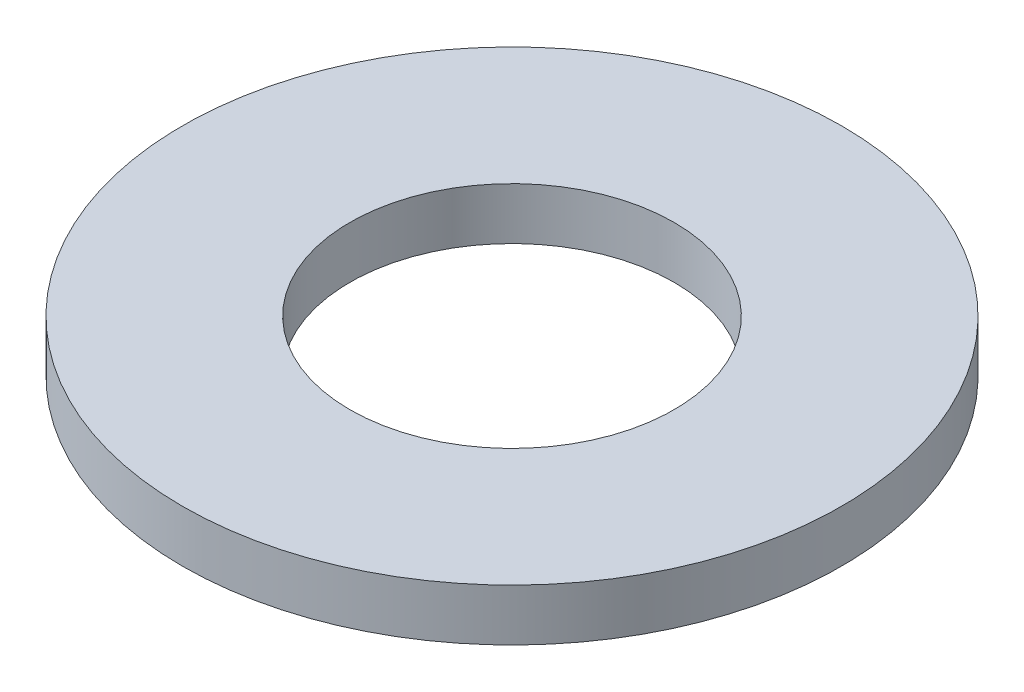
ISO-10303-21;
HEADER;
FILE_DESCRIPTION(('STEP AP214'),'2;1');
FILE_NAME('part.step','',(''),(''),'','','');
FILE_SCHEMA(('AUTOMOTIVE_DESIGN { 1 0 10303 214 1 1 1 1 }'));
ENDSEC;
DATA;
#1=APPLICATION_CONTEXT('core data for automotive mechanical design processes');
#2=APPLICATION_PROTOCOL_DEFINITION('international standard','automotive_design',2000,#1);
#3=PRODUCT_CONTEXT('',#1,'mechanical');
#4=PRODUCT('Part','Part','',(#3));
#5=PRODUCT_RELATED_PRODUCT_CATEGORY('part','',(#4));
#6=PRODUCT_DEFINITION_FORMATION('','',#4);
#7=PRODUCT_DEFINITION_CONTEXT('part definition',#1,'design');
#8=PRODUCT_DEFINITION('design','',#6,#7);
#9=PRODUCT_DEFINITION_SHAPE('','',#8);
#10=(LENGTH_UNIT() NAMED_UNIT(*) SI_UNIT(.MILLI.,.METRE.));
#11=(NAMED_UNIT(*) PLANE_ANGLE_UNIT() SI_UNIT($,.RADIAN.));
#12=(NAMED_UNIT(*) SI_UNIT($,.STERADIAN.) SOLID_ANGLE_UNIT());
#13=UNCERTAINTY_MEASURE_WITH_UNIT(LENGTH_MEASURE(1.E-05),#10,'distance_accuracy_value','');
#14=(GEOMETRIC_REPRESENTATION_CONTEXT(3) GLOBAL_UNCERTAINTY_ASSIGNED_CONTEXT((#13)) GLOBAL_UNIT_ASSIGNED_CONTEXT((#10,
#11,#12)) REPRESENTATION_CONTEXT('',''));
#15=CARTESIAN_POINT('',(0.,0.,0.));
#16=DIRECTION('',(0.,0.,1.));
#17=DIRECTION('',(1.,0.,0.));
#18=AXIS2_PLACEMENT_3D('',#15,#16,#17);
#19=CARTESIAN_POINT('',(0.,12.,0.));
#20=DIRECTION('',(0.,-1.,0.));
#21=DIRECTION('',(0.,0.,-1.));
#22=AXIS2_PLACEMENT_3D('',#19,#20,#21);
#23=CYLINDRICAL_SURFACE('',#22,76.2);
#24=CARTESIAN_POINT('',(0.,12.,0.));
#25=DIRECTION('',(0.,1.,0.));
#26=DIRECTION('',(0.,0.,1.));
#27=AXIS2_PLACEMENT_3D('',#24,#25,#26);
#28=CIRCLE('',#27,76.2);
#29=CARTESIAN_POINT('',(0.,12.,76.2));
#30=VERTEX_POINT('',#29);
#31=EDGE_CURVE('E10',#30,#30,#28,.T.);
#32=ORIENTED_EDGE('',*,*,#31,.F.);
#33=EDGE_LOOP('',(#32));
#34=FACE_BOUND('',#33,.T.);
#35=CARTESIAN_POINT('',(0.,0.,0.));
#36=DIRECTION('',(0.,1.,0.));
#37=DIRECTION('',(0.,0.,1.));
#38=AXIS2_PLACEMENT_3D('',#35,#36,#37);
#39=CIRCLE('',#38,76.2);
#40=CARTESIAN_POINT('',(0.,0.,76.2));
#41=VERTEX_POINT('',#40);
#42=EDGE_CURVE('E46',#41,#41,#39,.T.);
#43=ORIENTED_EDGE('',*,*,#42,.T.);
#44=EDGE_LOOP('',(#43));
#45=FACE_BOUND('',#44,.T.);
#46=ADVANCED_FACE('F43',(#34,#45),#23,.T.);
#47=CARTESIAN_POINT('',(0.,12.,0.));
#48=DIRECTION('',(0.,1.,0.));
#49=DIRECTION('',(0.,0.,1.));
#50=AXIS2_PLACEMENT_3D('',#47,#48,#49);
#51=PLANE('',#50);
#52=CARTESIAN_POINT('',(0.,12.,0.));
#53=DIRECTION('',(0.,1.,0.));
#54=DIRECTION('',(0.,0.,1.));
#55=AXIS2_PLACEMENT_3D('',#52,#53,#54);
#56=CIRCLE('',#55,37.5);
#57=CARTESIAN_POINT('',(0.,12.,37.5));
#58=VERTEX_POINT('',#57);
#59=EDGE_CURVE('E57',#58,#58,#56,.T.);
#60=ORIENTED_EDGE('',*,*,#59,.F.);
#61=EDGE_LOOP('',(#60));
#62=FACE_BOUND('',#61,.T.);
#63=ORIENTED_EDGE('',*,*,#31,.T.);
#64=EDGE_LOOP('',(#63));
#65=FACE_BOUND('',#64,.T.);
#66=ADVANCED_FACE('F74',(#62,#65),#51,.T.);
#67=CARTESIAN_POINT('',(0.,0.,0.));
#68=DIRECTION('',(0.,1.,0.));
#69=DIRECTION('',(0.,0.,1.));
#70=AXIS2_PLACEMENT_3D('',#67,#68,#69);
#71=PLANE('',#70);
#72=CARTESIAN_POINT('',(0.,0.,0.));
#73=DIRECTION('',(0.,1.,0.));
#74=DIRECTION('',(0.,0.,1.));
#75=AXIS2_PLACEMENT_3D('',#72,#73,#74);
#76=CIRCLE('',#75,37.5);
#77=CARTESIAN_POINT('',(0.,0.,37.5));
#78=VERTEX_POINT('',#77);
#79=EDGE_CURVE('E55',#78,#78,#76,.T.);
#80=ORIENTED_EDGE('',*,*,#79,.T.);
#81=EDGE_LOOP('',(#80));
#82=FACE_BOUND('',#81,.T.);
#83=ORIENTED_EDGE('',*,*,#42,.F.);
#84=EDGE_LOOP('',(#83));
#85=FACE_BOUND('',#84,.T.);
#86=ADVANCED_FACE('F65',(#82,#85),#71,.F.);
#87=CARTESIAN_POINT('',(0.,0.,0.));
#88=DIRECTION('',(0.,1.,0.));
#89=DIRECTION('',(0.,0.,1.));
#90=AXIS2_PLACEMENT_3D('',#87,#88,#89);
#91=CYLINDRICAL_SURFACE('',#90,37.5);
#92=ORIENTED_EDGE('',*,*,#79,.F.);
#93=EDGE_LOOP('',(#92));
#94=FACE_BOUND('',#93,.T.);
#95=ORIENTED_EDGE('',*,*,#59,.T.);
#96=EDGE_LOOP('',(#95));
#97=FACE_BOUND('',#96,.T.);
#98=ADVANCED_FACE('F68',(#94,#97),#91,.F.);
#99=CLOSED_SHELL('',(#46,#66,#86,#98));
#100=MANIFOLD_SOLID_BREP('B2',#99);
#101=ADVANCED_BREP_SHAPE_REPRESENTATION('',(#18,#100),#14);
#102=SHAPE_DEFINITION_REPRESENTATION(#9,#101);
ENDSEC;
END-ISO-10303-21;
